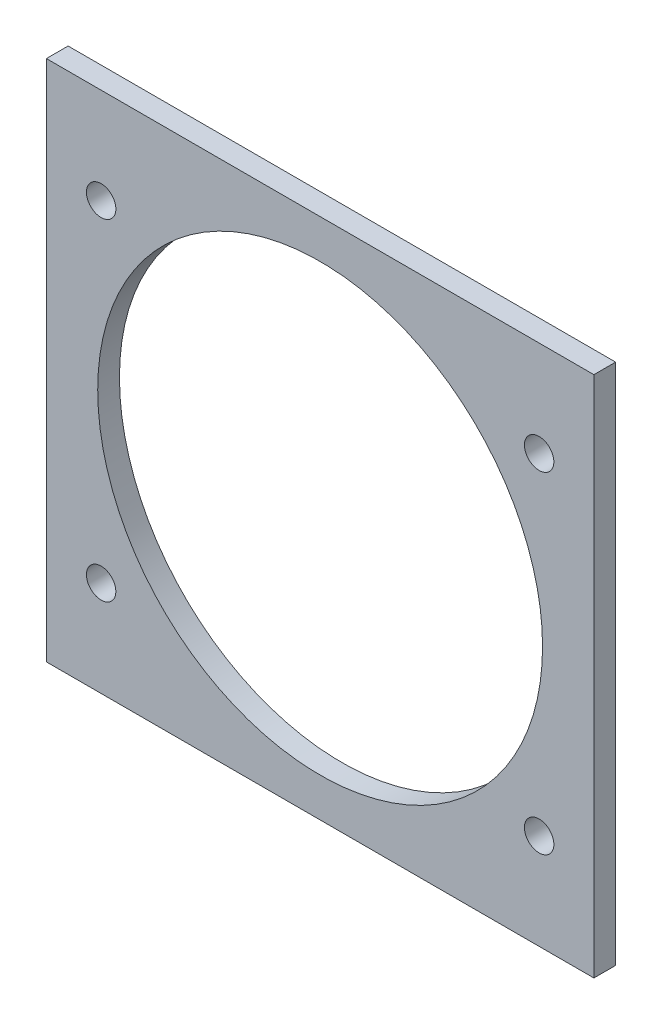
ISO-10303-21;
HEADER;
FILE_DESCRIPTION(('STEP AP214'),'2;1');
FILE_NAME('part.step','',(''),(''),'','','');
FILE_SCHEMA(('AUTOMOTIVE_DESIGN { 1 0 10303 214 1 1 1 1 }'));
ENDSEC;
DATA;
#1=APPLICATION_CONTEXT('core data for automotive mechanical design processes');
#2=APPLICATION_PROTOCOL_DEFINITION('international standard','automotive_design',2000,#1);
#3=PRODUCT_CONTEXT('',#1,'mechanical');
#4=PRODUCT('Part','Part','',(#3));
#5=PRODUCT_RELATED_PRODUCT_CATEGORY('part','',(#4));
#6=PRODUCT_DEFINITION_FORMATION('','',#4);
#7=PRODUCT_DEFINITION_CONTEXT('part definition',#1,'design');
#8=PRODUCT_DEFINITION('design','',#6,#7);
#9=PRODUCT_DEFINITION_SHAPE('','',#8);
#10=(LENGTH_UNIT() NAMED_UNIT(*) SI_UNIT(.MILLI.,.METRE.));
#11=(NAMED_UNIT(*) PLANE_ANGLE_UNIT() SI_UNIT($,.RADIAN.));
#12=(NAMED_UNIT(*) SI_UNIT($,.STERADIAN.) SOLID_ANGLE_UNIT());
#13=UNCERTAINTY_MEASURE_WITH_UNIT(LENGTH_MEASURE(1.E-05),#10,'distance_accuracy_value','');
#14=(GEOMETRIC_REPRESENTATION_CONTEXT(3) GLOBAL_UNCERTAINTY_ASSIGNED_CONTEXT((#13)) GLOBAL_UNIT_ASSIGNED_CONTEXT((#10,
#11,#12)) REPRESENTATION_CONTEXT('',''));
#15=CARTESIAN_POINT('',(0.,0.,0.));
#16=DIRECTION('',(0.,0.,1.));
#17=DIRECTION('',(1.,0.,0.));
#18=AXIS2_PLACEMENT_3D('',#15,#16,#17);
#19=CARTESIAN_POINT('',(0.,0.,3.175));
#20=DIRECTION('',(0.,0.,-1.));
#21=DIRECTION('',(-1.,0.,0.));
#22=AXIS2_PLACEMENT_3D('',#19,#20,#21);
#23=PLANE('',#22);
#24=DIRECTION('',(0.,1.,0.));
#25=VECTOR('',#24,1.);
#26=CARTESIAN_POINT('',(40.,-38.175,3.175));
#27=LINE('',#26,#25);
#28=CARTESIAN_POINT('',(40.,-38.175,3.175));
#29=VERTEX_POINT('',#28);
#30=CARTESIAN_POINT('',(40.,38.175,3.175));
#31=VERTEX_POINT('',#30);
#32=EDGE_CURVE('E98',#29,#31,#27,.T.);
#33=ORIENTED_EDGE('',*,*,#32,.T.);
#34=DIRECTION('',(-1.,0.,0.));
#35=VECTOR('',#34,1.);
#36=CARTESIAN_POINT('',(-40.,38.175,3.175));
#37=LINE('',#36,#35);
#38=CARTESIAN_POINT('',(-40.,38.175,3.175));
#39=VERTEX_POINT('',#38);
#40=EDGE_CURVE('E93',#31,#39,#37,.T.);
#41=ORIENTED_EDGE('',*,*,#40,.T.);
#42=DIRECTION('',(0.,-1.,0.));
#43=VECTOR('',#42,1.);
#44=CARTESIAN_POINT('',(-40.,-38.175,3.175));
#45=LINE('',#44,#43);
#46=CARTESIAN_POINT('',(-40.,-38.175,3.175));
#47=VERTEX_POINT('',#46);
#48=EDGE_CURVE('E96',#39,#47,#45,.T.);
#49=ORIENTED_EDGE('',*,*,#48,.T.);
#50=DIRECTION('',(1.,0.,0.));
#51=VECTOR('',#50,1.);
#52=CARTESIAN_POINT('',(-40.,-38.175,3.175));
#53=LINE('',#52,#51);
#54=EDGE_CURVE('E63',#47,#29,#53,.T.);
#55=ORIENTED_EDGE('',*,*,#54,.T.);
#56=EDGE_LOOP('',(#33,#41,#49,#55));
#57=FACE_BOUND('',#56,.T.);
#58=CARTESIAN_POINT('',(-32.,24.2,3.175));
#59=DIRECTION('',(0.,0.,1.));
#60=DIRECTION('',(1.,0.,0.));
#61=AXIS2_PLACEMENT_3D('',#58,#59,#60);
#62=CIRCLE('',#61,2.15);
#63=CARTESIAN_POINT('',(-29.85,24.2,3.175));
#64=VERTEX_POINT('',#63);
#65=EDGE_CURVE('E118',#64,#64,#62,.T.);
#66=ORIENTED_EDGE('',*,*,#65,.F.);
#67=EDGE_LOOP('',(#66));
#68=FACE_BOUND('',#67,.T.);
#69=CARTESIAN_POINT('',(-32.,-24.2,3.175));
#70=DIRECTION('',(0.,0.,1.));
#71=DIRECTION('',(-1.,0.,0.));
#72=AXIS2_PLACEMENT_3D('',#69,#70,#71);
#73=CIRCLE('',#72,2.15);
#74=CARTESIAN_POINT('',(-34.15,-24.2,3.175));
#75=VERTEX_POINT('',#74);
#76=EDGE_CURVE('E140',#75,#75,#73,.T.);
#77=ORIENTED_EDGE('',*,*,#76,.F.);
#78=EDGE_LOOP('',(#77));
#79=FACE_BOUND('',#78,.T.);
#80=CARTESIAN_POINT('',(32.,-24.2,3.175));
#81=DIRECTION('',(0.,0.,1.));
#82=DIRECTION('',(1.,0.,0.));
#83=AXIS2_PLACEMENT_3D('',#80,#81,#82);
#84=CIRCLE('',#83,2.15);
#85=CARTESIAN_POINT('',(34.15,-24.2,3.175));
#86=VERTEX_POINT('',#85);
#87=EDGE_CURVE('E148',#86,#86,#84,.T.);
#88=ORIENTED_EDGE('',*,*,#87,.F.);
#89=EDGE_LOOP('',(#88));
#90=FACE_BOUND('',#89,.T.);
#91=CARTESIAN_POINT('',(32.,24.2,3.175));
#92=DIRECTION('',(0.,0.,1.));
#93=DIRECTION('',(-1.,0.,0.));
#94=AXIS2_PLACEMENT_3D('',#91,#92,#93);
#95=CIRCLE('',#94,2.15);
#96=CARTESIAN_POINT('',(29.85,24.2,3.175));
#97=VERTEX_POINT('',#96);
#98=EDGE_CURVE('E156',#97,#97,#95,.T.);
#99=ORIENTED_EDGE('',*,*,#98,.F.);
#100=EDGE_LOOP('',(#99));
#101=FACE_BOUND('',#100,.T.);
#102=CARTESIAN_POINT('',(0.,0.,3.175));
#103=DIRECTION('',(0.,0.,1.));
#104=DIRECTION('',(1.,0.,0.));
#105=AXIS2_PLACEMENT_3D('',#102,#103,#104);
#106=CIRCLE('',#105,32.5);
#107=CARTESIAN_POINT('',(32.5,0.,3.175));
#108=VERTEX_POINT('',#107);
#109=EDGE_CURVE('E164',#108,#108,#106,.T.);
#110=ORIENTED_EDGE('',*,*,#109,.F.);
#111=EDGE_LOOP('',(#110));
#112=FACE_BOUND('',#111,.T.);
#113=ADVANCED_FACE('F45',(#57,#68,#79,#90,#101,#112),#23,.F.);
#114=CARTESIAN_POINT('',(0.,0.,0.));
#115=DIRECTION('',(0.,0.,-1.));
#116=DIRECTION('',(-1.,0.,0.));
#117=AXIS2_PLACEMENT_3D('',#114,#115,#116);
#118=PLANE('',#117);
#119=CARTESIAN_POINT('',(32.,24.2,0.));
#120=DIRECTION('',(0.,0.,1.));
#121=DIRECTION('',(-1.,0.,0.));
#122=AXIS2_PLACEMENT_3D('',#119,#120,#121);
#123=CIRCLE('',#122,2.15);
#124=CARTESIAN_POINT('',(29.85,24.2,0.));
#125=VERTEX_POINT('',#124);
#126=EDGE_CURVE('E160',#125,#125,#123,.T.);
#127=ORIENTED_EDGE('',*,*,#126,.T.);
#128=EDGE_LOOP('',(#127));
#129=FACE_BOUND('',#128,.T.);
#130=CARTESIAN_POINT('',(-32.,-24.2,0.));
#131=DIRECTION('',(0.,0.,1.));
#132=DIRECTION('',(-1.,0.,0.));
#133=AXIS2_PLACEMENT_3D('',#130,#131,#132);
#134=CIRCLE('',#133,2.15);
#135=CARTESIAN_POINT('',(-34.15,-24.2,0.));
#136=VERTEX_POINT('',#135);
#137=EDGE_CURVE('E144',#136,#136,#134,.T.);
#138=ORIENTED_EDGE('',*,*,#137,.T.);
#139=EDGE_LOOP('',(#138));
#140=FACE_BOUND('',#139,.T.);
#141=DIRECTION('',(0.,1.,0.));
#142=VECTOR('',#141,1.);
#143=CARTESIAN_POINT('',(40.,-38.175,0.));
#144=LINE('',#143,#142);
#145=CARTESIAN_POINT('',(40.,-38.175,0.));
#146=VERTEX_POINT('',#145);
#147=CARTESIAN_POINT('',(40.,38.175,0.));
#148=VERTEX_POINT('',#147);
#149=EDGE_CURVE('E114',#146,#148,#144,.T.);
#150=ORIENTED_EDGE('',*,*,#149,.F.);
#151=DIRECTION('',(1.,0.,0.));
#152=VECTOR('',#151,1.);
#153=CARTESIAN_POINT('',(-40.,-38.175,0.));
#154=LINE('',#153,#152);
#155=CARTESIAN_POINT('',(-40.,-38.175,0.));
#156=VERTEX_POINT('',#155);
#157=EDGE_CURVE('E86',#156,#146,#154,.T.);
#158=ORIENTED_EDGE('',*,*,#157,.F.);
#159=DIRECTION('',(0.,-1.,0.));
#160=VECTOR('',#159,1.);
#161=CARTESIAN_POINT('',(-40.,-38.175,0.));
#162=LINE('',#161,#160);
#163=CARTESIAN_POINT('',(-40.,38.175,0.));
#164=VERTEX_POINT('',#163);
#165=EDGE_CURVE('E80',#164,#156,#162,.T.);
#166=ORIENTED_EDGE('',*,*,#165,.F.);
#167=DIRECTION('',(-1.,0.,0.));
#168=VECTOR('',#167,1.);
#169=CARTESIAN_POINT('',(-40.,38.175,0.));
#170=LINE('',#169,#168);
#171=EDGE_CURVE('E103',#148,#164,#170,.T.);
#172=ORIENTED_EDGE('',*,*,#171,.F.);
#173=EDGE_LOOP('',(#150,#158,#166,#172));
#174=FACE_BOUND('',#173,.T.);
#175=CARTESIAN_POINT('',(-32.,24.2,0.));
#176=DIRECTION('',(0.,0.,1.));
#177=DIRECTION('',(1.,0.,0.));
#178=AXIS2_PLACEMENT_3D('',#175,#176,#177);
#179=CIRCLE('',#178,2.15);
#180=CARTESIAN_POINT('',(-29.85,24.2,0.));
#181=VERTEX_POINT('',#180);
#182=EDGE_CURVE('E136',#181,#181,#179,.T.);
#183=ORIENTED_EDGE('',*,*,#182,.T.);
#184=EDGE_LOOP('',(#183));
#185=FACE_BOUND('',#184,.T.);
#186=CARTESIAN_POINT('',(32.,-24.2,0.));
#187=DIRECTION('',(0.,0.,1.));
#188=DIRECTION('',(1.,0.,0.));
#189=AXIS2_PLACEMENT_3D('',#186,#187,#188);
#190=CIRCLE('',#189,2.15);
#191=CARTESIAN_POINT('',(34.15,-24.2,0.));
#192=VERTEX_POINT('',#191);
#193=EDGE_CURVE('E152',#192,#192,#190,.T.);
#194=ORIENTED_EDGE('',*,*,#193,.T.);
#195=EDGE_LOOP('',(#194));
#196=FACE_BOUND('',#195,.T.);
#197=CARTESIAN_POINT('',(0.,0.,0.));
#198=DIRECTION('',(0.,0.,1.));
#199=DIRECTION('',(1.,0.,0.));
#200=AXIS2_PLACEMENT_3D('',#197,#198,#199);
#201=CIRCLE('',#200,32.5);
#202=CARTESIAN_POINT('',(32.5,0.,0.));
#203=VERTEX_POINT('',#202);
#204=EDGE_CURVE('E168',#203,#203,#201,.T.);
#205=ORIENTED_EDGE('',*,*,#204,.T.);
#206=EDGE_LOOP('',(#205));
#207=FACE_BOUND('',#206,.T.);
#208=ADVANCED_FACE('F131',(#129,#140,#174,#185,#196,#207),#118,.T.);
#209=CARTESIAN_POINT('',(40.,-38.175,3.175));
#210=DIRECTION('',(-1.,0.,0.));
#211=DIRECTION('',(0.,0.,1.));
#212=AXIS2_PLACEMENT_3D('',#209,#210,#211);
#213=PLANE('',#212);
#214=ORIENTED_EDGE('',*,*,#149,.T.);
#215=DIRECTION('',(0.,0.,-1.));
#216=VECTOR('',#215,1.);
#217=CARTESIAN_POINT('',(40.,38.175,3.175));
#218=LINE('',#217,#216);
#219=EDGE_CURVE('E11',#31,#148,#218,.T.);
#220=ORIENTED_EDGE('',*,*,#219,.F.);
#221=ORIENTED_EDGE('',*,*,#32,.F.);
#222=DIRECTION('',(0.,0.,-1.));
#223=VECTOR('',#222,1.);
#224=CARTESIAN_POINT('',(40.,-38.175,3.175));
#225=LINE('',#224,#223);
#226=EDGE_CURVE('E110',#29,#146,#225,.T.);
#227=ORIENTED_EDGE('',*,*,#226,.T.);
#228=EDGE_LOOP('',(#214,#220,#221,#227));
#229=FACE_BOUND('',#228,.T.);
#230=ADVANCED_FACE('F47',(#229),#213,.F.);
#231=CARTESIAN_POINT('',(-40.,38.175,3.175));
#232=DIRECTION('',(0.,-1.,0.));
#233=DIRECTION('',(0.,0.,-1.));
#234=AXIS2_PLACEMENT_3D('',#231,#232,#233);
#235=PLANE('',#234);
#236=ORIENTED_EDGE('',*,*,#171,.T.);
#237=DIRECTION('',(0.,0.,-1.));
#238=VECTOR('',#237,1.);
#239=CARTESIAN_POINT('',(-40.,38.175,3.175));
#240=LINE('',#239,#238);
#241=EDGE_CURVE('E55',#39,#164,#240,.T.);
#242=ORIENTED_EDGE('',*,*,#241,.F.);
#243=ORIENTED_EDGE('',*,*,#40,.F.);
#244=ORIENTED_EDGE('',*,*,#219,.T.);
#245=EDGE_LOOP('',(#236,#242,#243,#244));
#246=FACE_BOUND('',#245,.T.);
#247=ADVANCED_FACE('F102',(#246),#235,.F.);
#248=CARTESIAN_POINT('',(-40.,-38.175,3.175));
#249=DIRECTION('',(1.,0.,0.));
#250=DIRECTION('',(0.,0.,-1.));
#251=AXIS2_PLACEMENT_3D('',#248,#249,#250);
#252=PLANE('',#251);
#253=ORIENTED_EDGE('',*,*,#165,.T.);
#254=DIRECTION('',(0.,0.,-1.));
#255=VECTOR('',#254,1.);
#256=CARTESIAN_POINT('',(-40.,-38.175,3.175));
#257=LINE('',#256,#255);
#258=EDGE_CURVE('E105',#47,#156,#257,.T.);
#259=ORIENTED_EDGE('',*,*,#258,.F.);
#260=ORIENTED_EDGE('',*,*,#48,.F.);
#261=ORIENTED_EDGE('',*,*,#241,.T.);
#262=EDGE_LOOP('',(#253,#259,#260,#261));
#263=FACE_BOUND('',#262,.T.);
#264=ADVANCED_FACE('F106',(#263),#252,.F.);
#265=CARTESIAN_POINT('',(-40.,-38.175,3.175));
#266=DIRECTION('',(0.,1.,0.));
#267=DIRECTION('',(0.,0.,1.));
#268=AXIS2_PLACEMENT_3D('',#265,#266,#267);
#269=PLANE('',#268);
#270=ORIENTED_EDGE('',*,*,#157,.T.);
#271=ORIENTED_EDGE('',*,*,#226,.F.);
#272=ORIENTED_EDGE('',*,*,#54,.F.);
#273=ORIENTED_EDGE('',*,*,#258,.T.);
#274=EDGE_LOOP('',(#270,#271,#272,#273));
#275=FACE_BOUND('',#274,.T.);
#276=ADVANCED_FACE('F128',(#275),#269,.F.);
#277=CARTESIAN_POINT('',(-32.,24.2,3.175));
#278=DIRECTION('',(0.,0.,-1.));
#279=DIRECTION('',(-1.,0.,0.));
#280=AXIS2_PLACEMENT_3D('',#277,#278,#279);
#281=CYLINDRICAL_SURFACE('',#280,2.15);
#282=ORIENTED_EDGE('',*,*,#65,.T.);
#283=EDGE_LOOP('',(#282));
#284=FACE_BOUND('',#283,.T.);
#285=ORIENTED_EDGE('',*,*,#182,.F.);
#286=EDGE_LOOP('',(#285));
#287=FACE_BOUND('',#286,.T.);
#288=ADVANCED_FACE('F187',(#284,#287),#281,.F.);
#289=CARTESIAN_POINT('',(-32.,-24.2,3.175));
#290=DIRECTION('',(0.,0.,-1.));
#291=DIRECTION('',(-1.,0.,0.));
#292=AXIS2_PLACEMENT_3D('',#289,#290,#291);
#293=CYLINDRICAL_SURFACE('',#292,2.15);
#294=ORIENTED_EDGE('',*,*,#76,.T.);
#295=EDGE_LOOP('',(#294));
#296=FACE_BOUND('',#295,.T.);
#297=ORIENTED_EDGE('',*,*,#137,.F.);
#298=EDGE_LOOP('',(#297));
#299=FACE_BOUND('',#298,.T.);
#300=ADVANCED_FACE('F232',(#296,#299),#293,.F.);
#301=CARTESIAN_POINT('',(32.,-24.2,3.175));
#302=DIRECTION('',(0.,0.,-1.));
#303=DIRECTION('',(-1.,0.,0.));
#304=AXIS2_PLACEMENT_3D('',#301,#302,#303);
#305=CYLINDRICAL_SURFACE('',#304,2.15);
#306=ORIENTED_EDGE('',*,*,#87,.T.);
#307=EDGE_LOOP('',(#306));
#308=FACE_BOUND('',#307,.T.);
#309=ORIENTED_EDGE('',*,*,#193,.F.);
#310=EDGE_LOOP('',(#309));
#311=FACE_BOUND('',#310,.T.);
#312=ADVANCED_FACE('F240',(#308,#311),#305,.F.);
#313=CARTESIAN_POINT('',(32.,24.2,3.175));
#314=DIRECTION('',(0.,0.,-1.));
#315=DIRECTION('',(-1.,0.,0.));
#316=AXIS2_PLACEMENT_3D('',#313,#314,#315);
#317=CYLINDRICAL_SURFACE('',#316,2.15);
#318=ORIENTED_EDGE('',*,*,#98,.T.);
#319=EDGE_LOOP('',(#318));
#320=FACE_BOUND('',#319,.T.);
#321=ORIENTED_EDGE('',*,*,#126,.F.);
#322=EDGE_LOOP('',(#321));
#323=FACE_BOUND('',#322,.T.);
#324=ADVANCED_FACE('F248',(#320,#323),#317,.F.);
#325=CARTESIAN_POINT('',(0.,0.,3.175));
#326=DIRECTION('',(0.,0.,-1.));
#327=DIRECTION('',(-1.,0.,0.));
#328=AXIS2_PLACEMENT_3D('',#325,#326,#327);
#329=CYLINDRICAL_SURFACE('',#328,32.5);
#330=ORIENTED_EDGE('',*,*,#109,.T.);
#331=EDGE_LOOP('',(#330));
#332=FACE_BOUND('',#331,.T.);
#333=ORIENTED_EDGE('',*,*,#204,.F.);
#334=EDGE_LOOP('',(#333));
#335=FACE_BOUND('',#334,.T.);
#336=ADVANCED_FACE('F176',(#332,#335),#329,.F.);
#337=CLOSED_SHELL('',(#113,#208,#230,#247,#264,#276,#288,#300,#312,#324,#336));
#338=MANIFOLD_SOLID_BREP('B2',#337);
#339=ADVANCED_BREP_SHAPE_REPRESENTATION('',(#18,#338),#14);
#340=SHAPE_DEFINITION_REPRESENTATION(#9,#339);
ENDSEC;
END-ISO-10303-21;
